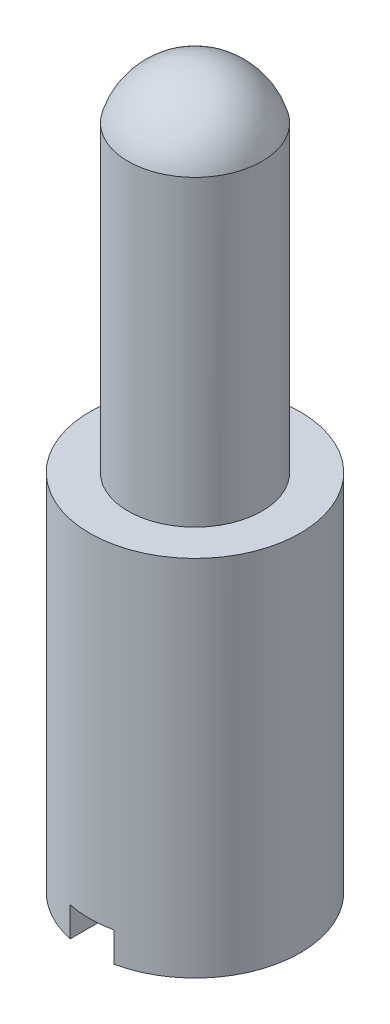
ISO-10303-21;
HEADER;
FILE_DESCRIPTION(('STEP AP214'),'2;1');
FILE_NAME('part.step','',(''),(''),'','','');
FILE_SCHEMA(('AUTOMOTIVE_DESIGN { 1 0 10303 214 1 1 1 1 }'));
ENDSEC;
DATA;
#1=APPLICATION_CONTEXT('core data for automotive mechanical design processes');
#2=APPLICATION_PROTOCOL_DEFINITION('international standard','automotive_design',2000,#1);
#3=PRODUCT_CONTEXT('',#1,'mechanical');
#4=PRODUCT('Part','Part','',(#3));
#5=PRODUCT_RELATED_PRODUCT_CATEGORY('part','',(#4));
#6=PRODUCT_DEFINITION_FORMATION('','',#4);
#7=PRODUCT_DEFINITION_CONTEXT('part definition',#1,'design');
#8=PRODUCT_DEFINITION('design','',#6,#7);
#9=PRODUCT_DEFINITION_SHAPE('','',#8);
#10=(LENGTH_UNIT() NAMED_UNIT(*) SI_UNIT(.MILLI.,.METRE.));
#11=(NAMED_UNIT(*) PLANE_ANGLE_UNIT() SI_UNIT($,.RADIAN.));
#12=(NAMED_UNIT(*) SI_UNIT($,.STERADIAN.) SOLID_ANGLE_UNIT());
#13=UNCERTAINTY_MEASURE_WITH_UNIT(LENGTH_MEASURE(1.E-05),#10,'distance_accuracy_value','');
#14=(GEOMETRIC_REPRESENTATION_CONTEXT(3) GLOBAL_UNCERTAINTY_ASSIGNED_CONTEXT((#13)) GLOBAL_UNIT_ASSIGNED_CONTEXT((#10,
#11,#12)) REPRESENTATION_CONTEXT('',''));
#15=CARTESIAN_POINT('',(0.,0.,0.));
#16=DIRECTION('',(0.,0.,1.));
#17=DIRECTION('',(1.,0.,0.));
#18=AXIS2_PLACEMENT_3D('',#15,#16,#17);
#19=CARTESIAN_POINT('',(0.,0.,0.));
#20=DIRECTION('',(0.,-1.,0.));
#21=DIRECTION('',(0.,0.,-1.));
#22=AXIS2_PLACEMENT_3D('',#19,#20,#21);
#23=PLANE('',#22);
#24=DIRECTION('',(0.,0.,1.));
#25=VECTOR('',#24,1.);
#26=CARTESIAN_POINT('',(-0.5842,0.,-2.794));
#27=LINE('',#26,#25);
#28=CARTESIAN_POINT('',(-0.5842,0.,-2.73224200245879));
#29=VERTEX_POINT('',#28);
#30=CARTESIAN_POINT('',(-0.5842,0.,2.73224200245879));
#31=VERTEX_POINT('',#30);
#32=EDGE_CURVE('E104',#29,#31,#27,.T.);
#33=ORIENTED_EDGE('',*,*,#32,.T.);
#34=CARTESIAN_POINT('',(0.,0.,0.));
#35=DIRECTION('',(0.,-1.,0.));
#36=DIRECTION('',(0.,0.,-1.));
#37=AXIS2_PLACEMENT_3D('',#34,#35,#36);
#38=CIRCLE('',#37,2.794);
#39=EDGE_CURVE('E111',#31,#29,#38,.T.);
#40=ORIENTED_EDGE('',*,*,#39,.T.);
#41=EDGE_LOOP('',(#33,#40));
#42=FACE_BOUND('',#41,.T.);
#43=ADVANCED_FACE('F50',(#42),#23,.T.);
#44=DIRECTION('',(0.,0.,1.));
#45=VECTOR('',#44,1.);
#46=CARTESIAN_POINT('',(0.5842,0.,-2.794));
#47=LINE('',#46,#45);
#48=CARTESIAN_POINT('',(0.5842,0.,-2.73224200245879));
#49=VERTEX_POINT('',#48);
#50=CARTESIAN_POINT('',(0.5842,0.,2.73224200245879));
#51=VERTEX_POINT('',#50);
#52=EDGE_CURVE('E93',#49,#51,#47,.T.);
#53=ORIENTED_EDGE('',*,*,#52,.F.);
#54=EDGE_CURVE('E102',#49,#51,#38,.T.);
#55=ORIENTED_EDGE('',*,*,#54,.T.);
#56=EDGE_LOOP('',(#53,#55));
#57=FACE_BOUND('',#56,.T.);
#58=ADVANCED_FACE('F52',(#57),#23,.T.);
#59=CARTESIAN_POINT('',(0.,0.,0.));
#60=DIRECTION('',(0.,-1.,0.));
#61=DIRECTION('',(0.,0.,-1.));
#62=AXIS2_PLACEMENT_3D('',#59,#60,#61);
#63=CYLINDRICAL_SURFACE('',#62,2.794);
#64=DIRECTION('',(0.,-1.,0.));
#65=VECTOR('',#64,1.);
#66=CARTESIAN_POINT('',(-0.5842,0.,2.73224200245879));
#67=LINE('',#66,#65);
#68=CARTESIAN_POINT('',(-0.5842,0.7874,2.73224200245879));
#69=VERTEX_POINT('',#68);
#70=EDGE_CURVE('E12',#69,#31,#67,.T.);
#71=ORIENTED_EDGE('',*,*,#70,.F.);
#72=CARTESIAN_POINT('',(0.,0.7874,0.));
#73=DIRECTION('',(0.,1.,0.));
#74=DIRECTION('',(0.,0.,1.));
#75=AXIS2_PLACEMENT_3D('',#72,#73,#74);
#76=CIRCLE('',#75,2.794);
#77=CARTESIAN_POINT('',(0.5842,0.7874,2.73224200245879));
#78=VERTEX_POINT('',#77);
#79=EDGE_CURVE('E73',#78,#69,#76,.F.);
#80=ORIENTED_EDGE('',*,*,#79,.F.);
#81=DIRECTION('',(0.,-1.,0.));
#82=VECTOR('',#81,1.);
#83=CARTESIAN_POINT('',(0.5842,0.,2.73224200245879));
#84=LINE('',#83,#82);
#85=EDGE_CURVE('E109',#51,#78,#84,.F.);
#86=ORIENTED_EDGE('',*,*,#85,.F.);
#87=ORIENTED_EDGE('',*,*,#54,.F.);
#88=DIRECTION('',(0.,-1.,0.));
#89=VECTOR('',#88,1.);
#90=CARTESIAN_POINT('',(0.5842,0.,-2.73224200245879));
#91=LINE('',#90,#89);
#92=CARTESIAN_POINT('',(0.5842,0.7874,-2.73224200245879));
#93=VERTEX_POINT('',#92);
#94=EDGE_CURVE('E90',#93,#49,#91,.T.);
#95=ORIENTED_EDGE('',*,*,#94,.F.);
#96=CARTESIAN_POINT('',(-0.5842,0.7874,-2.73224200245879));
#97=VERTEX_POINT('',#96);
#98=EDGE_CURVE('E98',#97,#93,#76,.F.);
#99=ORIENTED_EDGE('',*,*,#98,.F.);
#100=DIRECTION('',(0.,-1.,0.));
#101=VECTOR('',#100,1.);
#102=CARTESIAN_POINT('',(-0.5842,0.,-2.73224200245879));
#103=LINE('',#102,#101);
#104=EDGE_CURVE('E59',#29,#97,#103,.F.);
#105=ORIENTED_EDGE('',*,*,#104,.F.);
#106=ORIENTED_EDGE('',*,*,#39,.F.);
#107=EDGE_LOOP('',(#71,#80,#86,#87,#95,#99,#105,#106));
#108=FACE_BOUND('',#107,.T.);
#109=CARTESIAN_POINT('',(0.,9.652,0.));
#110=DIRECTION('',(0.,-1.,0.));
#111=DIRECTION('',(0.,0.,-1.));
#112=AXIS2_PLACEMENT_3D('',#109,#110,#111);
#113=CIRCLE('',#112,2.794);
#114=CARTESIAN_POINT('',(0.,9.652,-2.794));
#115=VERTEX_POINT('',#114);
#116=EDGE_CURVE('E117',#115,#115,#113,.T.);
#117=ORIENTED_EDGE('',*,*,#116,.T.);
#118=EDGE_LOOP('',(#117));
#119=FACE_BOUND('',#118,.T.);
#120=ADVANCED_FACE('F107',(#108,#119),#63,.T.);
#121=CARTESIAN_POINT('',(2.794,9.652,0.));
#122=DIRECTION('',(0.,1.,0.));
#123=DIRECTION('',(0.,0.,1.));
#124=AXIS2_PLACEMENT_3D('',#121,#122,#123);
#125=PLANE('',#124);
#126=CARTESIAN_POINT('',(0.,9.652,0.));
#127=DIRECTION('',(0.,-1.,0.));
#128=DIRECTION('',(0.,0.,-1.));
#129=AXIS2_PLACEMENT_3D('',#126,#127,#128);
#130=CIRCLE('',#129,1.778);
#131=CARTESIAN_POINT('',(0.,9.652,-1.778));
#132=VERTEX_POINT('',#131);
#133=EDGE_CURVE('E137',#132,#132,#130,.T.);
#134=ORIENTED_EDGE('',*,*,#133,.T.);
#135=EDGE_LOOP('',(#134));
#136=FACE_BOUND('',#135,.T.);
#137=ORIENTED_EDGE('',*,*,#116,.F.);
#138=EDGE_LOOP('',(#137));
#139=FACE_BOUND('',#138,.T.);
#140=ADVANCED_FACE('F150',(#136,#139),#125,.T.);
#141=CARTESIAN_POINT('',(0.,0.,0.));
#142=DIRECTION('',(0.,-1.,0.));
#143=DIRECTION('',(0.,0.,-1.));
#144=AXIS2_PLACEMENT_3D('',#141,#142,#143);
#145=CYLINDRICAL_SURFACE('',#144,1.778);
#146=CARTESIAN_POINT('',(0.,17.6964978552641,0.));
#147=DIRECTION('',(0.,-1.,0.));
#148=DIRECTION('',(0.,0.,-1.));
#149=AXIS2_PLACEMENT_3D('',#146,#147,#148);
#150=CIRCLE('',#149,1.778);
#151=CARTESIAN_POINT('',(0.,17.6964978552641,-1.778));
#152=VERTEX_POINT('',#151);
#153=EDGE_CURVE('E132',#152,#152,#150,.T.);
#154=ORIENTED_EDGE('',*,*,#153,.T.);
#155=EDGE_LOOP('',(#154));
#156=FACE_BOUND('',#155,.T.);
#157=ORIENTED_EDGE('',*,*,#133,.F.);
#158=EDGE_LOOP('',(#157));
#159=FACE_BOUND('',#158,.T.);
#160=ADVANCED_FACE('F152',(#156,#159),#145,.T.);
#161=CARTESIAN_POINT('',(0.,17.2054325291524,0.));
#162=DIRECTION('',(0.,-1.,0.));
#163=DIRECTION('',(1.,0.,0.));
#164=AXIS2_PLACEMENT_3D('',#161,#162,#163);
#165=SPHERICAL_SURFACE('',#164,1.84456747084761);
#166=ORIENTED_EDGE('',*,*,#153,.F.);
#167=EDGE_LOOP('',(#166));
#168=FACE_BOUND('',#167,.T.);
#169=ADVANCED_FACE('F159',(#168),#165,.T.);
#170=CARTESIAN_POINT('',(-0.5842,0.,-2.794));
#171=DIRECTION('',(-1.,0.,0.));
#172=DIRECTION('',(0.,0.,1.));
#173=AXIS2_PLACEMENT_3D('',#170,#171,#172);
#174=PLANE('',#173);
#175=ORIENTED_EDGE('',*,*,#104,.T.);
#176=DIRECTION('',(0.,0.,1.));
#177=VECTOR('',#176,1.);
#178=CARTESIAN_POINT('',(-0.5842,0.7874,-2.794));
#179=LINE('',#178,#177);
#180=EDGE_CURVE('E127',#97,#69,#179,.T.);
#181=ORIENTED_EDGE('',*,*,#180,.T.);
#182=ORIENTED_EDGE('',*,*,#70,.T.);
#183=ORIENTED_EDGE('',*,*,#32,.F.);
#184=EDGE_LOOP('',(#175,#181,#182,#183));
#185=FACE_BOUND('',#184,.T.);
#186=ADVANCED_FACE('F126',(#185),#174,.F.);
#187=CARTESIAN_POINT('',(-0.5842,0.7874,-2.794));
#188=DIRECTION('',(0.,1.,0.));
#189=DIRECTION('',(0.,0.,1.));
#190=AXIS2_PLACEMENT_3D('',#187,#188,#189);
#191=PLANE('',#190);
#192=ORIENTED_EDGE('',*,*,#180,.F.);
#193=ORIENTED_EDGE('',*,*,#98,.T.);
#194=DIRECTION('',(0.,0.,1.));
#195=VECTOR('',#194,1.);
#196=CARTESIAN_POINT('',(0.5842,0.7874,-2.794));
#197=LINE('',#196,#195);
#198=EDGE_CURVE('E66',#93,#78,#197,.T.);
#199=ORIENTED_EDGE('',*,*,#198,.T.);
#200=ORIENTED_EDGE('',*,*,#79,.T.);
#201=EDGE_LOOP('',(#192,#193,#199,#200));
#202=FACE_BOUND('',#201,.T.);
#203=ADVANCED_FACE('F130',(#202),#191,.F.);
#204=CARTESIAN_POINT('',(0.5842,0.,-2.794));
#205=DIRECTION('',(1.,0.,0.));
#206=DIRECTION('',(0.,0.,-1.));
#207=AXIS2_PLACEMENT_3D('',#204,#205,#206);
#208=PLANE('',#207);
#209=ORIENTED_EDGE('',*,*,#85,.T.);
#210=ORIENTED_EDGE('',*,*,#198,.F.);
#211=ORIENTED_EDGE('',*,*,#94,.T.);
#212=ORIENTED_EDGE('',*,*,#52,.T.);
#213=EDGE_LOOP('',(#209,#210,#211,#212));
#214=FACE_BOUND('',#213,.T.);
#215=ADVANCED_FACE('F92',(#214),#208,.F.);
#216=CLOSED_SHELL('',(#43,#58,#120,#140,#160,#169,#186,#203,#215));
#217=MANIFOLD_SOLID_BREP('B2',#216);
#218=ADVANCED_BREP_SHAPE_REPRESENTATION('',(#18,#217),#14);
#219=SHAPE_DEFINITION_REPRESENTATION(#9,#218);
ENDSEC;
END-ISO-10303-21;
